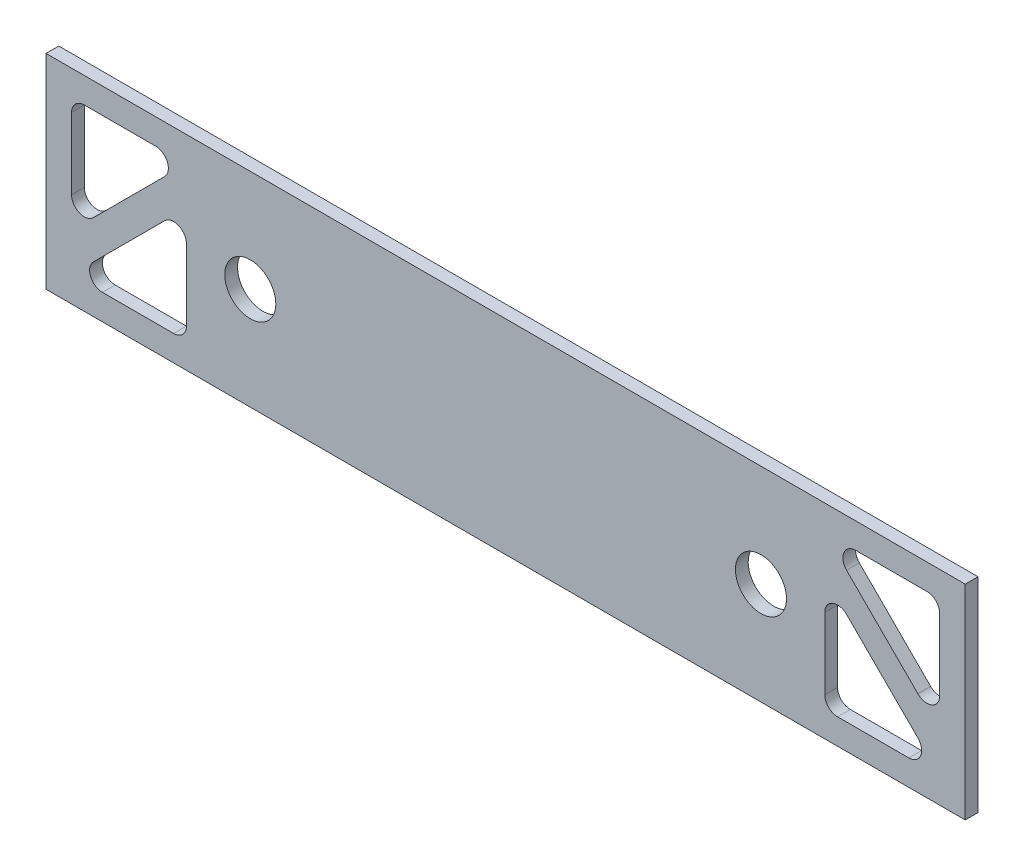
ISO-10303-21;
HEADER;
FILE_DESCRIPTION(('STEP AP214'),'2;1');
FILE_NAME('part.step','',(''),(''),'','','');
FILE_SCHEMA(('AUTOMOTIVE_DESIGN { 1 0 10303 214 1 1 1 1 }'));
ENDSEC;
DATA;
#1=APPLICATION_CONTEXT('core data for automotive mechanical design processes');
#2=APPLICATION_PROTOCOL_DEFINITION('international standard','automotive_design',2000,#1);
#3=PRODUCT_CONTEXT('',#1,'mechanical');
#4=PRODUCT('Part','Part','',(#3));
#5=PRODUCT_RELATED_PRODUCT_CATEGORY('part','',(#4));
#6=PRODUCT_DEFINITION_FORMATION('','',#4);
#7=PRODUCT_DEFINITION_CONTEXT('part definition',#1,'design');
#8=PRODUCT_DEFINITION('design','',#6,#7);
#9=PRODUCT_DEFINITION_SHAPE('','',#8);
#10=(LENGTH_UNIT() NAMED_UNIT(*) SI_UNIT(.MILLI.,.METRE.));
#11=(NAMED_UNIT(*) PLANE_ANGLE_UNIT() SI_UNIT($,.RADIAN.));
#12=(NAMED_UNIT(*) SI_UNIT($,.STERADIAN.) SOLID_ANGLE_UNIT());
#13=UNCERTAINTY_MEASURE_WITH_UNIT(LENGTH_MEASURE(1.E-05),#10,'distance_accuracy_value','');
#14=(GEOMETRIC_REPRESENTATION_CONTEXT(3) GLOBAL_UNCERTAINTY_ASSIGNED_CONTEXT((#13)) GLOBAL_UNIT_ASSIGNED_CONTEXT((#10,
#11,#12)) REPRESENTATION_CONTEXT('',''));
#15=CARTESIAN_POINT('',(0.,0.,0.));
#16=DIRECTION('',(0.,0.,1.));
#17=DIRECTION('',(1.,0.,0.));
#18=AXIS2_PLACEMENT_3D('',#15,#16,#17);
#19=CARTESIAN_POINT('',(457.2,8.61913239514614,-5.08837174822385));
#20=DIRECTION('',(0.,0.,1.));
#21=DIRECTION('',(0.,-1.,0.));
#22=AXIS2_PLACEMENT_3D('',#19,#20,#21);
#23=PLANE('',#22);
#24=DIRECTION('',(0.707106781186548,0.707106781186548,0.));
#25=VECTOR('',#24,1.);
#26=CARTESIAN_POINT('',(59.0098719394653,-33.9709956653885,-5.08837174822385));
#27=LINE('',#26,#25);
#28=CARTESIAN_POINT('',(23.5401280605346,-69.4407395443192,-5.08837174822386));
#29=VERTEX_POINT('',#28);
#30=CARTESIAN_POINT('',(59.0098719394653,-33.9709956653885,-5.08837174822385));
#31=VERTEX_POINT('',#30);
#32=EDGE_CURVE('E249',#29,#31,#27,.T.);
#33=ORIENTED_EDGE('',*,*,#32,.F.);
#34=CARTESIAN_POINT('',(28.0302561210691,-73.9308676048539,-5.08837174822386));
#35=DIRECTION('',(0.,0.,-1.));
#36=DIRECTION('',(0.,-1.,0.));
#37=AXIS2_PLACEMENT_3D('',#34,#35,#36);
#38=CIRCLE('',#37,6.35000000000001);
#39=CARTESIAN_POINT('',(28.0302561210693,-80.2808676048539,-5.08837174822386));
#40=VERTEX_POINT('',#39);
#41=EDGE_CURVE('E46',#40,#29,#38,.T.);
#42=ORIENTED_EDGE('',*,*,#41,.F.);
#43=DIRECTION('',(-1.,0.,0.));
#44=VECTOR('',#43,1.);
#45=CARTESIAN_POINT('',(28.0302561210693,-80.2808676048539,-5.08837174822386));
#46=LINE('',#45,#44);
#47=CARTESIAN_POINT('',(63.4999999999999,-80.2808676048539,-5.08837174822386));
#48=VERTEX_POINT('',#47);
#49=EDGE_CURVE('E235',#48,#40,#46,.T.);
#50=ORIENTED_EDGE('',*,*,#49,.F.);
#51=CARTESIAN_POINT('',(63.4999999999999,-73.9308676048539,-5.08837174822386));
#52=DIRECTION('',(0.,0.,-1.));
#53=DIRECTION('',(0.,-1.,0.));
#54=AXIS2_PLACEMENT_3D('',#51,#52,#53);
#55=CIRCLE('',#54,6.35000000000001);
#56=CARTESIAN_POINT('',(69.85,-73.9308676048538,-5.08837174822386));
#57=VERTEX_POINT('',#56);
#58=EDGE_CURVE('E238',#57,#48,#55,.T.);
#59=ORIENTED_EDGE('',*,*,#58,.F.);
#60=DIRECTION('',(0.,-1.,0.));
#61=VECTOR('',#60,1.);
#62=CARTESIAN_POINT('',(69.85,-73.9308676048538,-5.08837174822386));
#63=LINE('',#62,#61);
#64=CARTESIAN_POINT('',(69.85,-38.4611237259231,-5.08837174822385));
#65=VERTEX_POINT('',#64);
#66=EDGE_CURVE('E254',#65,#57,#63,.T.);
#67=ORIENTED_EDGE('',*,*,#66,.F.);
#68=CARTESIAN_POINT('',(63.4999999999999,-38.461123725923,-5.08837174822385));
#69=DIRECTION('',(0.,0.,-1.));
#70=DIRECTION('',(0.,1.,0.));
#71=AXIS2_PLACEMENT_3D('',#68,#69,#70);
#72=CIRCLE('',#71,6.35000000000001);
#73=EDGE_CURVE('E251',#31,#65,#72,.T.);
#74=ORIENTED_EDGE('',*,*,#73,.F.);
#75=EDGE_LOOP('',(#33,#42,#50,#59,#67,#74));
#76=FACE_BOUND('',#75,.T.);
#77=DIRECTION('',(1.,0.,0.));
#78=VECTOR('',#77,1.);
#79=CARTESIAN_POINT('',(19.05,-4.08086760485386,-5.08837174822385));
#80=LINE('',#79,#78);
#81=CARTESIAN_POINT('',(19.05,-4.08086760485386,-5.08837174822385));
#82=VERTEX_POINT('',#81);
#83=CARTESIAN_POINT('',(54.5197438789307,-4.08086760485386,-5.08837174822385));
#84=VERTEX_POINT('',#83);
#85=EDGE_CURVE('E290',#82,#84,#80,.T.);
#86=ORIENTED_EDGE('',*,*,#85,.F.);
#87=CARTESIAN_POINT('',(19.05,-10.4308676048539,-5.08837174822385));
#88=DIRECTION('',(0.,0.,-1.));
#89=DIRECTION('',(0.,-1.,0.));
#90=AXIS2_PLACEMENT_3D('',#87,#88,#89);
#91=CIRCLE('',#90,6.35000000000001);
#92=CARTESIAN_POINT('',(12.7,-10.4308676048539,-5.08837174822385));
#93=VERTEX_POINT('',#92);
#94=EDGE_CURVE('E261',#93,#82,#91,.T.);
#95=ORIENTED_EDGE('',*,*,#94,.F.);
#96=DIRECTION('',(0.,1.,0.));
#97=VECTOR('',#96,1.);
#98=CARTESIAN_POINT('',(12.7,-10.4308676048539,-5.08837174822385));
#99=LINE('',#98,#97);
#100=CARTESIAN_POINT('',(12.7,-45.9006114837845,-5.08837174822386));
#101=VERTEX_POINT('',#100);
#102=EDGE_CURVE('E273',#101,#93,#99,.T.);
#103=ORIENTED_EDGE('',*,*,#102,.F.);
#104=CARTESIAN_POINT('',(19.05,-45.9006114837847,-5.08837174822386));
#105=DIRECTION('',(0.,0.,-1.));
#106=DIRECTION('',(0.,-1.,0.));
#107=AXIS2_PLACEMENT_3D('',#104,#105,#106);
#108=CIRCLE('',#107,6.35000000000001);
#109=CARTESIAN_POINT('',(23.5401280605347,-50.3907395443192,-5.08837174822386));
#110=VERTEX_POINT('',#109);
#111=EDGE_CURVE('E299',#110,#101,#108,.T.);
#112=ORIENTED_EDGE('',*,*,#111,.F.);
#113=DIRECTION('',(-0.707106781186547,-0.707106781186548,0.));
#114=VECTOR('',#113,1.);
#115=CARTESIAN_POINT('',(23.5401280605347,-50.3907395443192,-5.08837174822386));
#116=LINE('',#115,#114);
#117=CARTESIAN_POINT('',(59.0098719394653,-14.9209956653885,-5.08837174822385));
#118=VERTEX_POINT('',#117);
#119=EDGE_CURVE('E296',#118,#110,#116,.T.);
#120=ORIENTED_EDGE('',*,*,#119,.F.);
#121=CARTESIAN_POINT('',(54.5197438789308,-10.4308676048539,-5.08837174822385));
#122=DIRECTION('',(0.,0.,-1.));
#123=DIRECTION('',(0.,1.,0.));
#124=AXIS2_PLACEMENT_3D('',#121,#122,#123);
#125=CIRCLE('',#124,6.34999999999999);
#126=EDGE_CURVE('E293',#84,#118,#125,.T.);
#127=ORIENTED_EDGE('',*,*,#126,.F.);
#128=EDGE_LOOP('',(#86,#95,#103,#112,#120,#127));
#129=FACE_BOUND('',#128,.T.);
#130=DIRECTION('',(-0.707106781186547,0.707106781186548,0.));
#131=VECTOR('',#130,1.);
#132=CARTESIAN_POINT('',(433.659871939465,-50.3907395443192,-5.08837174822386));
#133=LINE('',#132,#131);
#134=CARTESIAN_POINT('',(433.659871939465,-50.3907395443191,-5.08837174822386));
#135=VERTEX_POINT('',#134);
#136=CARTESIAN_POINT('',(398.190128060535,-14.9209956653885,-5.08837174822385));
#137=VERTEX_POINT('',#136);
#138=EDGE_CURVE('E338',#135,#137,#133,.T.);
#139=ORIENTED_EDGE('',*,*,#138,.F.);
#140=CARTESIAN_POINT('',(438.15,-45.9006114837847,-5.08837174822386));
#141=DIRECTION('',(0.,0.,-1.));
#142=DIRECTION('',(0.,1.,0.));
#143=AXIS2_PLACEMENT_3D('',#140,#141,#142);
#144=CIRCLE('',#143,6.35000000000001);
#145=CARTESIAN_POINT('',(444.5,-45.9006114837845,-5.08837174822386));
#146=VERTEX_POINT('',#145);
#147=EDGE_CURVE('E306',#146,#135,#144,.T.);
#148=ORIENTED_EDGE('',*,*,#147,.F.);
#149=DIRECTION('',(0.,-1.,0.));
#150=VECTOR('',#149,1.);
#151=CARTESIAN_POINT('',(444.5,-10.4308676048539,-5.08837174822385));
#152=LINE('',#151,#150);
#153=CARTESIAN_POINT('',(444.5,-10.4308676048539,-5.08837174822385));
#154=VERTEX_POINT('',#153);
#155=EDGE_CURVE('E321',#154,#146,#152,.T.);
#156=ORIENTED_EDGE('',*,*,#155,.F.);
#157=CARTESIAN_POINT('',(438.15,-10.4308676048539,-5.08837174822385));
#158=DIRECTION('',(0.,0.,-1.));
#159=DIRECTION('',(0.,1.,0.));
#160=AXIS2_PLACEMENT_3D('',#157,#158,#159);
#161=CIRCLE('',#160,6.35000000000001);
#162=CARTESIAN_POINT('',(438.15,-4.08086760485385,-5.08837174822385));
#163=VERTEX_POINT('',#162);
#164=EDGE_CURVE('E347',#163,#154,#161,.T.);
#165=ORIENTED_EDGE('',*,*,#164,.F.);
#166=DIRECTION('',(1.,0.,0.));
#167=VECTOR('',#166,1.);
#168=CARTESIAN_POINT('',(438.15,-4.08086760485386,-5.08837174822385));
#169=LINE('',#168,#167);
#170=CARTESIAN_POINT('',(402.680256121069,-4.08086760485386,-5.08837174822385));
#171=VERTEX_POINT('',#170);
#172=EDGE_CURVE('E344',#171,#163,#169,.T.);
#173=ORIENTED_EDGE('',*,*,#172,.F.);
#174=CARTESIAN_POINT('',(402.680256121069,-10.4308676048539,-5.08837174822385));
#175=DIRECTION('',(0.,0.,-1.));
#176=DIRECTION('',(0.,-1.,0.));
#177=AXIS2_PLACEMENT_3D('',#174,#175,#176);
#178=CIRCLE('',#177,6.34999999999999);
#179=EDGE_CURVE('E341',#137,#171,#178,.T.);
#180=ORIENTED_EDGE('',*,*,#179,.F.);
#181=EDGE_LOOP('',(#139,#148,#156,#165,#173,#180));
#182=FACE_BOUND('',#181,.T.);
#183=DIRECTION('',(0.707106781186548,-0.707106781186548,0.));
#184=VECTOR('',#183,1.);
#185=CARTESIAN_POINT('',(398.190128060535,-33.9709956653885,-5.08837174822385));
#186=LINE('',#185,#184);
#187=CARTESIAN_POINT('',(398.190128060535,-33.9709956653885,-5.08837174822385));
#188=VERTEX_POINT('',#187);
#189=CARTESIAN_POINT('',(433.659871939465,-69.4407395443192,-5.08837174822386));
#190=VERTEX_POINT('',#189);
#191=EDGE_CURVE('E386',#188,#190,#186,.T.);
#192=ORIENTED_EDGE('',*,*,#191,.F.);
#193=CARTESIAN_POINT('',(393.7,-38.461123725923,-5.08837174822385));
#194=DIRECTION('',(0.,0.,-1.));
#195=DIRECTION('',(0.,-1.,0.));
#196=AXIS2_PLACEMENT_3D('',#193,#194,#195);
#197=CIRCLE('',#196,6.35000000000001);
#198=CARTESIAN_POINT('',(387.35,-38.4611237259231,-5.08837174822385));
#199=VERTEX_POINT('',#198);
#200=EDGE_CURVE('E354',#199,#188,#197,.T.);
#201=ORIENTED_EDGE('',*,*,#200,.F.);
#202=DIRECTION('',(0.,1.,0.));
#203=VECTOR('',#202,1.);
#204=CARTESIAN_POINT('',(387.35,-73.9308676048538,-5.08837174822386));
#205=LINE('',#204,#203);
#206=CARTESIAN_POINT('',(387.35,-73.9308676048538,-5.08837174822386));
#207=VERTEX_POINT('',#206);
#208=EDGE_CURVE('E369',#207,#199,#205,.T.);
#209=ORIENTED_EDGE('',*,*,#208,.F.);
#210=CARTESIAN_POINT('',(393.7,-73.9308676048539,-5.08837174822386));
#211=DIRECTION('',(0.,0.,-1.));
#212=DIRECTION('',(0.,1.,0.));
#213=AXIS2_PLACEMENT_3D('',#210,#211,#212);
#214=CIRCLE('',#213,6.35000000000001);
#215=CARTESIAN_POINT('',(393.7,-80.2808676048539,-5.08837174822386));
#216=VERTEX_POINT('',#215);
#217=EDGE_CURVE('E395',#216,#207,#214,.T.);
#218=ORIENTED_EDGE('',*,*,#217,.F.);
#219=DIRECTION('',(-1.,0.,0.));
#220=VECTOR('',#219,1.);
#221=CARTESIAN_POINT('',(429.169743878931,-80.2808676048539,-5.08837174822386));
#222=LINE('',#221,#220);
#223=CARTESIAN_POINT('',(429.169743878931,-80.2808676048539,-5.08837174822386));
#224=VERTEX_POINT('',#223);
#225=EDGE_CURVE('E392',#224,#216,#222,.T.);
#226=ORIENTED_EDGE('',*,*,#225,.F.);
#227=CARTESIAN_POINT('',(429.169743878931,-73.9308676048539,-5.08837174822386));
#228=DIRECTION('',(0.,0.,-1.));
#229=DIRECTION('',(0.,1.,0.));
#230=AXIS2_PLACEMENT_3D('',#227,#228,#229);
#231=CIRCLE('',#230,6.35000000000001);
#232=EDGE_CURVE('E389',#190,#224,#231,.T.);
#233=ORIENTED_EDGE('',*,*,#232,.F.);
#234=EDGE_LOOP('',(#192,#201,#209,#218,#226,#233));
#235=FACE_BOUND('',#234,.T.);
#236=CARTESIAN_POINT('',(101.6,-42.1808676048539,-5.08837174822385));
#237=DIRECTION('',(0.,0.,-1.));
#238=DIRECTION('',(0.,1.,0.));
#239=AXIS2_PLACEMENT_3D('',#236,#237,#238);
#240=CIRCLE('',#239,12.7);
#241=CARTESIAN_POINT('',(101.6,-29.4808676048539,-5.08837174822385));
#242=VERTEX_POINT('',#241);
#243=EDGE_CURVE('E402',#242,#242,#240,.T.);
#244=ORIENTED_EDGE('',*,*,#243,.F.);
#245=EDGE_LOOP('',(#244));
#246=FACE_BOUND('',#245,.T.);
#247=CARTESIAN_POINT('',(355.6,-42.1808676048539,-5.08837174822385));
#248=DIRECTION('',(0.,0.,-1.));
#249=DIRECTION('',(0.,1.,0.));
#250=AXIS2_PLACEMENT_3D('',#247,#248,#249);
#251=CIRCLE('',#250,12.7);
#252=CARTESIAN_POINT('',(355.6,-29.4808676048539,-5.08837174822385));
#253=VERTEX_POINT('',#252);
#254=EDGE_CURVE('E416',#253,#253,#251,.T.);
#255=ORIENTED_EDGE('',*,*,#254,.F.);
#256=EDGE_LOOP('',(#255));
#257=FACE_BOUND('',#256,.T.);
#258=DIRECTION('',(0.,1.,0.));
#259=VECTOR('',#258,1.);
#260=CARTESIAN_POINT('',(0.,8.61913239514614,-5.08837174822385));
#261=LINE('',#260,#259);
#262=CARTESIAN_POINT('',(0.,-92.9808676048539,-5.08837174822386));
#263=VERTEX_POINT('',#262);
#264=CARTESIAN_POINT('',(0.,8.61913239514614,-5.08837174822385));
#265=VERTEX_POINT('',#264);
#266=EDGE_CURVE('E422',#263,#265,#261,.T.);
#267=ORIENTED_EDGE('',*,*,#266,.T.);
#268=DIRECTION('',(-1.,0.,0.));
#269=VECTOR('',#268,1.);
#270=CARTESIAN_POINT('',(457.2,8.61913239514614,-5.08837174822385));
#271=LINE('',#270,#269);
#272=CARTESIAN_POINT('',(457.2,8.61913239514614,-5.08837174822385));
#273=VERTEX_POINT('',#272);
#274=EDGE_CURVE('E11',#273,#265,#271,.T.);
#275=ORIENTED_EDGE('',*,*,#274,.F.);
#276=DIRECTION('',(0.,1.,0.));
#277=VECTOR('',#276,1.);
#278=CARTESIAN_POINT('',(457.2,8.61913239514614,-5.08837174822385));
#279=LINE('',#278,#277);
#280=CARTESIAN_POINT('',(457.2,-92.9808676048539,-5.08837174822386));
#281=VERTEX_POINT('',#280);
#282=EDGE_CURVE('E425',#281,#273,#279,.T.);
#283=ORIENTED_EDGE('',*,*,#282,.F.);
#284=DIRECTION('',(-1.,0.,0.));
#285=VECTOR('',#284,1.);
#286=CARTESIAN_POINT('',(457.2,-92.9808676048539,-5.08837174822386));
#287=LINE('',#286,#285);
#288=EDGE_CURVE('E435',#281,#263,#287,.T.);
#289=ORIENTED_EDGE('',*,*,#288,.T.);
#290=EDGE_LOOP('',(#267,#275,#283,#289));
#291=FACE_BOUND('',#290,.T.);
#292=ADVANCED_FACE('F32',(#76,#129,#182,#235,#246,#257,#291),#23,.F.);
#293=CARTESIAN_POINT('',(457.2,8.61913239514614,-5.08837174822385));
#294=DIRECTION('',(0.,-1.,0.));
#295=DIRECTION('',(0.,0.,-1.));
#296=AXIS2_PLACEMENT_3D('',#293,#294,#295);
#297=PLANE('',#296);
#298=DIRECTION('',(0.,0.,1.));
#299=VECTOR('',#298,1.);
#300=CARTESIAN_POINT('',(0.,8.61913239514614,-5.08837174822385));
#301=LINE('',#300,#299);
#302=CARTESIAN_POINT('',(0.,8.61913239514614,1.26162825177615));
#303=VERTEX_POINT('',#302);
#304=EDGE_CURVE('E438',#265,#303,#301,.T.);
#305=ORIENTED_EDGE('',*,*,#304,.T.);
#306=DIRECTION('',(-1.,0.,0.));
#307=VECTOR('',#306,1.);
#308=CARTESIAN_POINT('',(457.2,8.61913239514614,1.26162825177615));
#309=LINE('',#308,#307);
#310=CARTESIAN_POINT('',(457.2,8.61913239514614,1.26162825177615));
#311=VERTEX_POINT('',#310);
#312=EDGE_CURVE('E39',#311,#303,#309,.T.);
#313=ORIENTED_EDGE('',*,*,#312,.F.);
#314=DIRECTION('',(0.,0.,1.));
#315=VECTOR('',#314,1.);
#316=CARTESIAN_POINT('',(457.2,8.61913239514614,-5.08837174822385));
#317=LINE('',#316,#315);
#318=EDGE_CURVE('E428',#273,#311,#317,.T.);
#319=ORIENTED_EDGE('',*,*,#318,.F.);
#320=ORIENTED_EDGE('',*,*,#274,.T.);
#321=EDGE_LOOP('',(#305,#313,#319,#320));
#322=FACE_BOUND('',#321,.T.);
#323=ADVANCED_FACE('F467',(#322),#297,.F.);
#324=CARTESIAN_POINT('',(457.2,8.61913239514614,1.26162825177615));
#325=DIRECTION('',(0.,0.,-1.));
#326=DIRECTION('',(0.,1.,0.));
#327=AXIS2_PLACEMENT_3D('',#324,#325,#326);
#328=PLANE('',#327);
#329=DIRECTION('',(-1.,0.,0.));
#330=VECTOR('',#329,1.);
#331=CARTESIAN_POINT('',(28.0302561210693,-80.2808676048539,1.26162825177616));
#332=LINE('',#331,#330);
#333=CARTESIAN_POINT('',(63.4999999999999,-80.2808676048539,1.26162825177616));
#334=VERTEX_POINT('',#333);
#335=CARTESIAN_POINT('',(28.0302561210693,-80.2808676048539,1.26162825177616));
#336=VERTEX_POINT('',#335);
#337=EDGE_CURVE('E224',#334,#336,#332,.T.);
#338=ORIENTED_EDGE('',*,*,#337,.T.);
#339=CARTESIAN_POINT('',(28.0302561210691,-73.9308676048539,1.26162825177616));
#340=DIRECTION('',(0.,0.,-1.));
#341=DIRECTION('',(0.,-1.,0.));
#342=AXIS2_PLACEMENT_3D('',#339,#340,#341);
#343=CIRCLE('',#342,6.35000000000001);
#344=CARTESIAN_POINT('',(23.5401280605346,-69.4407395443192,1.26162825177616));
#345=VERTEX_POINT('',#344);
#346=EDGE_CURVE('E218',#336,#345,#343,.T.);
#347=ORIENTED_EDGE('',*,*,#346,.T.);
#348=DIRECTION('',(0.707106781186548,0.707106781186548,0.));
#349=VECTOR('',#348,1.);
#350=CARTESIAN_POINT('',(59.0098719394653,-33.9709956653885,1.26162825177616));
#351=LINE('',#350,#349);
#352=CARTESIAN_POINT('',(59.0098719394653,-33.9709956653885,1.26162825177615));
#353=VERTEX_POINT('',#352);
#354=EDGE_CURVE('E227',#345,#353,#351,.T.);
#355=ORIENTED_EDGE('',*,*,#354,.T.);
#356=CARTESIAN_POINT('',(63.4999999999999,-38.461123725923,1.26162825177616));
#357=DIRECTION('',(0.,0.,-1.));
#358=DIRECTION('',(0.,1.,0.));
#359=AXIS2_PLACEMENT_3D('',#356,#357,#358);
#360=CIRCLE('',#359,6.35000000000001);
#361=CARTESIAN_POINT('',(69.85,-38.4611237259231,1.26162825177616));
#362=VERTEX_POINT('',#361);
#363=EDGE_CURVE('E54',#353,#362,#360,.T.);
#364=ORIENTED_EDGE('',*,*,#363,.T.);
#365=DIRECTION('',(0.,-1.,0.));
#366=VECTOR('',#365,1.);
#367=CARTESIAN_POINT('',(69.85,-73.9308676048538,1.26162825177616));
#368=LINE('',#367,#366);
#369=CARTESIAN_POINT('',(69.85,-73.9308676048538,1.26162825177616));
#370=VERTEX_POINT('',#369);
#371=EDGE_CURVE('E242',#362,#370,#368,.T.);
#372=ORIENTED_EDGE('',*,*,#371,.T.);
#373=CARTESIAN_POINT('',(63.4999999999999,-73.9308676048539,1.26162825177616));
#374=DIRECTION('',(0.,0.,-1.));
#375=DIRECTION('',(0.,-1.,0.));
#376=AXIS2_PLACEMENT_3D('',#373,#374,#375);
#377=CIRCLE('',#376,6.35000000000001);
#378=EDGE_CURVE('E245',#370,#334,#377,.T.);
#379=ORIENTED_EDGE('',*,*,#378,.T.);
#380=EDGE_LOOP('',(#338,#347,#355,#364,#372,#379));
#381=FACE_BOUND('',#380,.T.);
#382=DIRECTION('',(0.,1.,0.));
#383=VECTOR('',#382,1.);
#384=CARTESIAN_POINT('',(12.7,-10.4308676048539,1.26162825177617));
#385=LINE('',#384,#383);
#386=CARTESIAN_POINT('',(12.7,-45.9006114837845,1.26162825177616));
#387=VERTEX_POINT('',#386);
#388=CARTESIAN_POINT('',(12.7,-10.4308676048539,1.26162825177617));
#389=VERTEX_POINT('',#388);
#390=EDGE_CURVE('E285',#387,#389,#385,.T.);
#391=ORIENTED_EDGE('',*,*,#390,.T.);
#392=CARTESIAN_POINT('',(19.05,-10.4308676048539,1.26162825177617));
#393=DIRECTION('',(0.,0.,-1.));
#394=DIRECTION('',(0.,-1.,0.));
#395=AXIS2_PLACEMENT_3D('',#392,#393,#394);
#396=CIRCLE('',#395,6.35000000000001);
#397=CARTESIAN_POINT('',(19.05,-4.08086760485386,1.26162825177617));
#398=VERTEX_POINT('',#397);
#399=EDGE_CURVE('E269',#389,#398,#396,.T.);
#400=ORIENTED_EDGE('',*,*,#399,.T.);
#401=DIRECTION('',(1.,0.,0.));
#402=VECTOR('',#401,1.);
#403=CARTESIAN_POINT('',(19.05,-4.08086760485386,1.26162825177617));
#404=LINE('',#403,#402);
#405=CARTESIAN_POINT('',(54.5197438789307,-4.08086760485386,1.26162825177615));
#406=VERTEX_POINT('',#405);
#407=EDGE_CURVE('E272',#398,#406,#404,.T.);
#408=ORIENTED_EDGE('',*,*,#407,.T.);
#409=CARTESIAN_POINT('',(54.5197438789308,-10.4308676048539,1.26162825177617));
#410=DIRECTION('',(0.,0.,-1.));
#411=DIRECTION('',(0.,1.,0.));
#412=AXIS2_PLACEMENT_3D('',#409,#410,#411);
#413=CIRCLE('',#412,6.34999999999999);
#414=CARTESIAN_POINT('',(59.0098719394653,-14.9209956653885,1.26162825177617));
#415=VERTEX_POINT('',#414);
#416=EDGE_CURVE('E276',#406,#415,#413,.T.);
#417=ORIENTED_EDGE('',*,*,#416,.T.);
#418=DIRECTION('',(-0.707106781186547,-0.707106781186548,0.));
#419=VECTOR('',#418,1.);
#420=CARTESIAN_POINT('',(23.5401280605347,-50.3907395443192,1.26162825177616));
#421=LINE('',#420,#419);
#422=CARTESIAN_POINT('',(23.5401280605347,-50.3907395443192,1.26162825177616));
#423=VERTEX_POINT('',#422);
#424=EDGE_CURVE('E279',#415,#423,#421,.T.);
#425=ORIENTED_EDGE('',*,*,#424,.T.);
#426=CARTESIAN_POINT('',(19.05,-45.9006114837847,1.26162825177616));
#427=DIRECTION('',(0.,0.,-1.));
#428=DIRECTION('',(0.,-1.,0.));
#429=AXIS2_PLACEMENT_3D('',#426,#427,#428);
#430=CIRCLE('',#429,6.35000000000001);
#431=EDGE_CURVE('E282',#423,#387,#430,.T.);
#432=ORIENTED_EDGE('',*,*,#431,.T.);
#433=EDGE_LOOP('',(#391,#400,#408,#417,#425,#432));
#434=FACE_BOUND('',#433,.T.);
#435=DIRECTION('',(0.,-1.,0.));
#436=VECTOR('',#435,1.);
#437=CARTESIAN_POINT('',(444.5,-10.4308676048539,1.26162825177617));
#438=LINE('',#437,#436);
#439=CARTESIAN_POINT('',(444.5,-10.4308676048539,1.26162825177617));
#440=VERTEX_POINT('',#439);
#441=CARTESIAN_POINT('',(444.5,-45.9006114837845,1.26162825177616));
#442=VERTEX_POINT('',#441);
#443=EDGE_CURVE('E333',#440,#442,#438,.T.);
#444=ORIENTED_EDGE('',*,*,#443,.T.);
#445=CARTESIAN_POINT('',(438.15,-45.9006114837847,1.26162825177616));
#446=DIRECTION('',(0.,0.,-1.));
#447=DIRECTION('',(0.,1.,0.));
#448=AXIS2_PLACEMENT_3D('',#445,#446,#447);
#449=CIRCLE('',#448,6.35000000000001);
#450=CARTESIAN_POINT('',(433.659871939465,-50.3907395443192,1.26162825177616));
#451=VERTEX_POINT('',#450);
#452=EDGE_CURVE('E317',#442,#451,#449,.T.);
#453=ORIENTED_EDGE('',*,*,#452,.T.);
#454=DIRECTION('',(-0.707106781186547,0.707106781186548,0.));
#455=VECTOR('',#454,1.);
#456=CARTESIAN_POINT('',(433.659871939465,-50.3907395443192,1.26162825177616));
#457=LINE('',#456,#455);
#458=CARTESIAN_POINT('',(398.190128060535,-14.9209956653886,1.26162825177615));
#459=VERTEX_POINT('',#458);
#460=EDGE_CURVE('E320',#451,#459,#457,.T.);
#461=ORIENTED_EDGE('',*,*,#460,.T.);
#462=CARTESIAN_POINT('',(402.680256121069,-10.4308676048539,1.26162825177617));
#463=DIRECTION('',(0.,0.,-1.));
#464=DIRECTION('',(0.,-1.,0.));
#465=AXIS2_PLACEMENT_3D('',#462,#463,#464);
#466=CIRCLE('',#465,6.34999999999999);
#467=CARTESIAN_POINT('',(402.680256121069,-4.08086760485386,1.26162825177617));
#468=VERTEX_POINT('',#467);
#469=EDGE_CURVE('E324',#459,#468,#466,.T.);
#470=ORIENTED_EDGE('',*,*,#469,.T.);
#471=DIRECTION('',(1.,0.,0.));
#472=VECTOR('',#471,1.);
#473=CARTESIAN_POINT('',(438.15,-4.08086760485386,1.26162825177617));
#474=LINE('',#473,#472);
#475=CARTESIAN_POINT('',(438.15,-4.08086760485385,1.26162825177617));
#476=VERTEX_POINT('',#475);
#477=EDGE_CURVE('E327',#468,#476,#474,.T.);
#478=ORIENTED_EDGE('',*,*,#477,.T.);
#479=CARTESIAN_POINT('',(438.15,-10.4308676048539,1.26162825177617));
#480=DIRECTION('',(0.,0.,-1.));
#481=DIRECTION('',(0.,1.,0.));
#482=AXIS2_PLACEMENT_3D('',#479,#480,#481);
#483=CIRCLE('',#482,6.35000000000001);
#484=EDGE_CURVE('E330',#476,#440,#483,.T.);
#485=ORIENTED_EDGE('',*,*,#484,.T.);
#486=EDGE_LOOP('',(#444,#453,#461,#470,#478,#485));
#487=FACE_BOUND('',#486,.T.);
#488=DIRECTION('',(0.,1.,0.));
#489=VECTOR('',#488,1.);
#490=CARTESIAN_POINT('',(387.35,-73.9308676048538,1.26162825177616));
#491=LINE('',#490,#489);
#492=CARTESIAN_POINT('',(387.35,-73.9308676048538,1.26162825177616));
#493=VERTEX_POINT('',#492);
#494=CARTESIAN_POINT('',(387.35,-38.4611237259231,1.26162825177616));
#495=VERTEX_POINT('',#494);
#496=EDGE_CURVE('E381',#493,#495,#491,.T.);
#497=ORIENTED_EDGE('',*,*,#496,.T.);
#498=CARTESIAN_POINT('',(393.7,-38.461123725923,1.26162825177616));
#499=DIRECTION('',(0.,0.,-1.));
#500=DIRECTION('',(0.,-1.,0.));
#501=AXIS2_PLACEMENT_3D('',#498,#499,#500);
#502=CIRCLE('',#501,6.35000000000001);
#503=CARTESIAN_POINT('',(398.190128060535,-33.9709956653885,1.26162825177616));
#504=VERTEX_POINT('',#503);
#505=EDGE_CURVE('E365',#495,#504,#502,.T.);
#506=ORIENTED_EDGE('',*,*,#505,.T.);
#507=DIRECTION('',(0.707106781186548,-0.707106781186548,0.));
#508=VECTOR('',#507,1.);
#509=CARTESIAN_POINT('',(398.190128060535,-33.9709956653885,1.26162825177616));
#510=LINE('',#509,#508);
#511=CARTESIAN_POINT('',(433.659871939465,-69.4407395443191,1.26162825177614));
#512=VERTEX_POINT('',#511);
#513=EDGE_CURVE('E368',#504,#512,#510,.T.);
#514=ORIENTED_EDGE('',*,*,#513,.T.);
#515=CARTESIAN_POINT('',(429.169743878931,-73.9308676048539,1.26162825177616));
#516=DIRECTION('',(0.,0.,-1.));
#517=DIRECTION('',(0.,1.,0.));
#518=AXIS2_PLACEMENT_3D('',#515,#516,#517);
#519=CIRCLE('',#518,6.35000000000001);
#520=CARTESIAN_POINT('',(429.169743878931,-80.2808676048539,1.26162825177616));
#521=VERTEX_POINT('',#520);
#522=EDGE_CURVE('E372',#512,#521,#519,.T.);
#523=ORIENTED_EDGE('',*,*,#522,.T.);
#524=DIRECTION('',(-1.,0.,0.));
#525=VECTOR('',#524,1.);
#526=CARTESIAN_POINT('',(429.169743878931,-80.2808676048539,1.26162825177616));
#527=LINE('',#526,#525);
#528=CARTESIAN_POINT('',(393.7,-80.2808676048539,1.26162825177616));
#529=VERTEX_POINT('',#528);
#530=EDGE_CURVE('E375',#521,#529,#527,.T.);
#531=ORIENTED_EDGE('',*,*,#530,.T.);
#532=CARTESIAN_POINT('',(393.7,-73.9308676048539,1.26162825177616));
#533=DIRECTION('',(0.,0.,-1.));
#534=DIRECTION('',(0.,1.,0.));
#535=AXIS2_PLACEMENT_3D('',#532,#533,#534);
#536=CIRCLE('',#535,6.35000000000001);
#537=EDGE_CURVE('E378',#529,#493,#536,.T.);
#538=ORIENTED_EDGE('',*,*,#537,.T.);
#539=EDGE_LOOP('',(#497,#506,#514,#523,#531,#538));
#540=FACE_BOUND('',#539,.T.);
#541=CARTESIAN_POINT('',(101.6,-42.1808676048539,1.26162825177616));
#542=DIRECTION('',(0.,0.,-1.));
#543=DIRECTION('',(0.,1.,0.));
#544=AXIS2_PLACEMENT_3D('',#541,#542,#543);
#545=CIRCLE('',#544,12.7);
#546=CARTESIAN_POINT('',(101.6,-29.4808676048539,1.26162825177616));
#547=VERTEX_POINT('',#546);
#548=EDGE_CURVE('E413',#547,#547,#545,.T.);
#549=ORIENTED_EDGE('',*,*,#548,.T.);
#550=EDGE_LOOP('',(#549));
#551=FACE_BOUND('',#550,.T.);
#552=CARTESIAN_POINT('',(355.6,-42.1808676048539,1.26162825177616));
#553=DIRECTION('',(0.,0.,-1.));
#554=DIRECTION('',(0.,1.,0.));
#555=AXIS2_PLACEMENT_3D('',#552,#553,#554);
#556=CIRCLE('',#555,12.7);
#557=CARTESIAN_POINT('',(355.6,-29.4808676048539,1.26162825177616));
#558=VERTEX_POINT('',#557);
#559=EDGE_CURVE('E419',#558,#558,#556,.T.);
#560=ORIENTED_EDGE('',*,*,#559,.T.);
#561=EDGE_LOOP('',(#560));
#562=FACE_BOUND('',#561,.T.);
#563=DIRECTION('',(0.,-1.,0.));
#564=VECTOR('',#563,1.);
#565=CARTESIAN_POINT('',(0.,8.61913239514614,1.26162825177615));
#566=LINE('',#565,#564);
#567=CARTESIAN_POINT('',(0.,-92.9808676048539,1.26162825177614));
#568=VERTEX_POINT('',#567);
#569=EDGE_CURVE('E440',#303,#568,#566,.T.);
#570=ORIENTED_EDGE('',*,*,#569,.T.);
#571=DIRECTION('',(-1.,0.,0.));
#572=VECTOR('',#571,1.);
#573=CARTESIAN_POINT('',(457.2,-92.9808676048539,1.26162825177614));
#574=LINE('',#573,#572);
#575=CARTESIAN_POINT('',(457.2,-92.9808676048539,1.26162825177614));
#576=VERTEX_POINT('',#575);
#577=EDGE_CURVE('E445',#576,#568,#574,.T.);
#578=ORIENTED_EDGE('',*,*,#577,.F.);
#579=DIRECTION('',(0.,-1.,0.));
#580=VECTOR('',#579,1.);
#581=CARTESIAN_POINT('',(457.2,8.61913239514614,1.26162825177615));
#582=LINE('',#581,#580);
#583=EDGE_CURVE('E431',#311,#576,#582,.T.);
#584=ORIENTED_EDGE('',*,*,#583,.F.);
#585=ORIENTED_EDGE('',*,*,#312,.T.);
#586=EDGE_LOOP('',(#570,#578,#584,#585));
#587=FACE_BOUND('',#586,.T.);
#588=ADVANCED_FACE('F231',(#381,#434,#487,#540,#551,#562,#587),#328,.F.);
#589=CARTESIAN_POINT('',(457.2,-92.9808676048539,-5.08837174822386));
#590=DIRECTION('',(0.,1.,0.));
#591=DIRECTION('',(0.,0.,1.));
#592=AXIS2_PLACEMENT_3D('',#589,#590,#591);
#593=PLANE('',#592);
#594=DIRECTION('',(0.,0.,-1.));
#595=VECTOR('',#594,1.);
#596=CARTESIAN_POINT('',(0.,-92.9808676048539,-5.08837174822386));
#597=LINE('',#596,#595);
#598=EDGE_CURVE('E429',#568,#263,#597,.T.);
#599=ORIENTED_EDGE('',*,*,#598,.T.);
#600=ORIENTED_EDGE('',*,*,#288,.F.);
#601=DIRECTION('',(0.,0.,-1.));
#602=VECTOR('',#601,1.);
#603=CARTESIAN_POINT('',(457.2,-92.9808676048539,-5.08837174822386));
#604=LINE('',#603,#602);
#605=EDGE_CURVE('E433',#576,#281,#604,.T.);
#606=ORIENTED_EDGE('',*,*,#605,.F.);
#607=ORIENTED_EDGE('',*,*,#577,.T.);
#608=EDGE_LOOP('',(#599,#600,#606,#607));
#609=FACE_BOUND('',#608,.T.);
#610=ADVANCED_FACE('F460',(#609),#593,.F.);
#611=CARTESIAN_POINT('',(457.2,0.,0.));
#612=DIRECTION('',(-1.,0.,0.));
#613=DIRECTION('',(0.,0.,1.));
#614=AXIS2_PLACEMENT_3D('',#611,#612,#613);
#615=PLANE('',#614);
#616=ORIENTED_EDGE('',*,*,#282,.T.);
#617=ORIENTED_EDGE('',*,*,#318,.T.);
#618=ORIENTED_EDGE('',*,*,#583,.T.);
#619=ORIENTED_EDGE('',*,*,#605,.T.);
#620=EDGE_LOOP('',(#616,#617,#618,#619));
#621=FACE_BOUND('',#620,.T.);
#622=ADVANCED_FACE('F466',(#621),#615,.F.);
#623=CARTESIAN_POINT('',(0.,0.,0.));
#624=DIRECTION('',(-1.,0.,0.));
#625=DIRECTION('',(0.,0.,1.));
#626=AXIS2_PLACEMENT_3D('',#623,#624,#625);
#627=PLANE('',#626);
#628=ORIENTED_EDGE('',*,*,#266,.F.);
#629=ORIENTED_EDGE('',*,*,#598,.F.);
#630=ORIENTED_EDGE('',*,*,#569,.F.);
#631=ORIENTED_EDGE('',*,*,#304,.F.);
#632=EDGE_LOOP('',(#628,#629,#630,#631));
#633=FACE_BOUND('',#632,.T.);
#634=ADVANCED_FACE('F457',(#633),#627,.T.);
#635=CARTESIAN_POINT('',(355.6,-42.1808676048539,1.26162825177616));
#636=DIRECTION('',(0.,0.,-1.));
#637=DIRECTION('',(0.,1.,0.));
#638=AXIS2_PLACEMENT_3D('',#635,#636,#637);
#639=CYLINDRICAL_SURFACE('',#638,12.7);
#640=ORIENTED_EDGE('',*,*,#559,.F.);
#641=EDGE_LOOP('',(#640));
#642=FACE_BOUND('',#641,.T.);
#643=ORIENTED_EDGE('',*,*,#254,.T.);
#644=EDGE_LOOP('',(#643));
#645=FACE_BOUND('',#644,.T.);
#646=ADVANCED_FACE('F482',(#642,#645),#639,.F.);
#647=CARTESIAN_POINT('',(101.6,-42.1808676048539,1.26162825177616));
#648=DIRECTION('',(0.,0.,-1.));
#649=DIRECTION('',(0.,1.,0.));
#650=AXIS2_PLACEMENT_3D('',#647,#648,#649);
#651=CYLINDRICAL_SURFACE('',#650,12.7);
#652=ORIENTED_EDGE('',*,*,#548,.F.);
#653=EDGE_LOOP('',(#652));
#654=FACE_BOUND('',#653,.T.);
#655=ORIENTED_EDGE('',*,*,#243,.T.);
#656=EDGE_LOOP('',(#655));
#657=FACE_BOUND('',#656,.T.);
#658=ADVANCED_FACE('F487',(#654,#657),#651,.F.);
#659=CARTESIAN_POINT('',(393.7,-38.461123725923,1.26162825177616));
#660=DIRECTION('',(0.,0.,-1.));
#661=DIRECTION('',(0.,1.,0.));
#662=AXIS2_PLACEMENT_3D('',#659,#660,#661);
#663=CYLINDRICAL_SURFACE('',#662,6.35000000000001);
#664=ORIENTED_EDGE('',*,*,#200,.T.);
#665=DIRECTION('',(0.,0.,-1.));
#666=VECTOR('',#665,1.);
#667=CARTESIAN_POINT('',(398.190128060535,-33.9709956653885,1.26162825177616));
#668=LINE('',#667,#666);
#669=EDGE_CURVE('E384',#504,#188,#668,.T.);
#670=ORIENTED_EDGE('',*,*,#669,.F.);
#671=ORIENTED_EDGE('',*,*,#505,.F.);
#672=DIRECTION('',(0.,0.,-1.));
#673=VECTOR('',#672,1.);
#674=CARTESIAN_POINT('',(387.35,-38.4611237259231,1.26162825177616));
#675=LINE('',#674,#673);
#676=EDGE_CURVE('E400',#495,#199,#675,.T.);
#677=ORIENTED_EDGE('',*,*,#676,.T.);
#678=EDGE_LOOP('',(#664,#670,#671,#677));
#679=FACE_BOUND('',#678,.T.);
#680=ADVANCED_FACE('F491',(#679),#663,.F.);
#681=CARTESIAN_POINT('',(387.35,-73.9308676048538,1.26162825177616));
#682=DIRECTION('',(-1.,0.,0.));
#683=DIRECTION('',(0.,0.,1.));
#684=AXIS2_PLACEMENT_3D('',#681,#682,#683);
#685=PLANE('',#684);
#686=ORIENTED_EDGE('',*,*,#208,.T.);
#687=ORIENTED_EDGE('',*,*,#676,.F.);
#688=ORIENTED_EDGE('',*,*,#496,.F.);
#689=DIRECTION('',(0.,0.,-1.));
#690=VECTOR('',#689,1.);
#691=CARTESIAN_POINT('',(387.35,-73.9308676048538,1.26162825177616));
#692=LINE('',#691,#690);
#693=EDGE_CURVE('E403',#493,#207,#692,.T.);
#694=ORIENTED_EDGE('',*,*,#693,.T.);
#695=EDGE_LOOP('',(#686,#687,#688,#694));
#696=FACE_BOUND('',#695,.T.);
#697=ADVANCED_FACE('F495',(#696),#685,.F.);
#698=CARTESIAN_POINT('',(393.7,-73.9308676048539,1.26162825177616));
#699=DIRECTION('',(0.,0.,-1.));
#700=DIRECTION('',(0.,1.,0.));
#701=AXIS2_PLACEMENT_3D('',#698,#699,#700);
#702=CYLINDRICAL_SURFACE('',#701,6.35000000000001);
#703=ORIENTED_EDGE('',*,*,#217,.T.);
#704=ORIENTED_EDGE('',*,*,#693,.F.);
#705=ORIENTED_EDGE('',*,*,#537,.F.);
#706=DIRECTION('',(0.,0.,-1.));
#707=VECTOR('',#706,1.);
#708=CARTESIAN_POINT('',(393.7,-80.2808676048539,1.26162825177616));
#709=LINE('',#708,#707);
#710=EDGE_CURVE('E405',#529,#216,#709,.T.);
#711=ORIENTED_EDGE('',*,*,#710,.T.);
#712=EDGE_LOOP('',(#703,#704,#705,#711));
#713=FACE_BOUND('',#712,.T.);
#714=ADVANCED_FACE('F509',(#713),#702,.F.);
#715=CARTESIAN_POINT('',(429.169743878931,-80.2808676048539,1.26162825177616));
#716=DIRECTION('',(0.,-1.,0.));
#717=DIRECTION('',(0.,0.,-1.));
#718=AXIS2_PLACEMENT_3D('',#715,#716,#717);
#719=PLANE('',#718);
#720=ORIENTED_EDGE('',*,*,#225,.T.);
#721=ORIENTED_EDGE('',*,*,#710,.F.);
#722=ORIENTED_EDGE('',*,*,#530,.F.);
#723=DIRECTION('',(0.,0.,-1.));
#724=VECTOR('',#723,1.);
#725=CARTESIAN_POINT('',(429.169743878931,-80.2808676048539,1.26162825177616));
#726=LINE('',#725,#724);
#727=EDGE_CURVE('E407',#521,#224,#726,.T.);
#728=ORIENTED_EDGE('',*,*,#727,.T.);
#729=EDGE_LOOP('',(#720,#721,#722,#728));
#730=FACE_BOUND('',#729,.T.);
#731=ADVANCED_FACE('F505',(#730),#719,.F.);
#732=CARTESIAN_POINT('',(429.169743878931,-73.9308676048539,1.26162825177616));
#733=DIRECTION('',(0.,0.,-1.));
#734=DIRECTION('',(0.,1.,0.));
#735=AXIS2_PLACEMENT_3D('',#732,#733,#734);
#736=CYLINDRICAL_SURFACE('',#735,6.35000000000001);
#737=ORIENTED_EDGE('',*,*,#232,.T.);
#738=ORIENTED_EDGE('',*,*,#727,.F.);
#739=ORIENTED_EDGE('',*,*,#522,.F.);
#740=DIRECTION('',(0.,0.,-1.));
#741=VECTOR('',#740,1.);
#742=CARTESIAN_POINT('',(433.659871939465,-69.4407395443192,1.26162825177616));
#743=LINE('',#742,#741);
#744=EDGE_CURVE('E409',#512,#190,#743,.T.);
#745=ORIENTED_EDGE('',*,*,#744,.T.);
#746=EDGE_LOOP('',(#737,#738,#739,#745));
#747=FACE_BOUND('',#746,.T.);
#748=ADVANCED_FACE('F501',(#747),#736,.F.);
#749=CARTESIAN_POINT('',(398.190128060535,-33.9709956653885,1.26162825177616));
#750=DIRECTION('',(0.707106781186547,0.707106781186547,0.));
#751=DIRECTION('',(-0.707106781186548,0.707106781186548,0.));
#752=AXIS2_PLACEMENT_3D('',#749,#750,#751);
#753=PLANE('',#752);
#754=ORIENTED_EDGE('',*,*,#191,.T.);
#755=ORIENTED_EDGE('',*,*,#744,.F.);
#756=ORIENTED_EDGE('',*,*,#513,.F.);
#757=ORIENTED_EDGE('',*,*,#669,.T.);
#758=EDGE_LOOP('',(#754,#755,#756,#757));
#759=FACE_BOUND('',#758,.T.);
#760=ADVANCED_FACE('F497',(#759),#753,.F.);
#761=CARTESIAN_POINT('',(438.15,-45.9006114837847,1.26162825177616));
#762=DIRECTION('',(0.,0.,-1.));
#763=DIRECTION('',(0.,1.,0.));
#764=AXIS2_PLACEMENT_3D('',#761,#762,#763);
#765=CYLINDRICAL_SURFACE('',#764,6.35000000000001);
#766=ORIENTED_EDGE('',*,*,#147,.T.);
#767=DIRECTION('',(0.,0.,-1.));
#768=VECTOR('',#767,1.);
#769=CARTESIAN_POINT('',(433.659871939465,-50.3907395443192,1.26162825177616));
#770=LINE('',#769,#768);
#771=EDGE_CURVE('E336',#451,#135,#770,.T.);
#772=ORIENTED_EDGE('',*,*,#771,.F.);
#773=ORIENTED_EDGE('',*,*,#452,.F.);
#774=DIRECTION('',(0.,0.,-1.));
#775=VECTOR('',#774,1.);
#776=CARTESIAN_POINT('',(444.5,-45.9006114837845,1.26162825177616));
#777=LINE('',#776,#775);
#778=EDGE_CURVE('E352',#442,#146,#777,.T.);
#779=ORIENTED_EDGE('',*,*,#778,.T.);
#780=EDGE_LOOP('',(#766,#772,#773,#779));
#781=FACE_BOUND('',#780,.T.);
#782=ADVANCED_FACE('F500',(#781),#765,.F.);
#783=CARTESIAN_POINT('',(444.5,-10.4308676048539,1.26162825177617));
#784=DIRECTION('',(1.,0.,0.));
#785=DIRECTION('',(0.,0.,-1.));
#786=AXIS2_PLACEMENT_3D('',#783,#784,#785);
#787=PLANE('',#786);
#788=ORIENTED_EDGE('',*,*,#155,.T.);
#789=ORIENTED_EDGE('',*,*,#778,.F.);
#790=ORIENTED_EDGE('',*,*,#443,.F.);
#791=DIRECTION('',(0.,0.,-1.));
#792=VECTOR('',#791,1.);
#793=CARTESIAN_POINT('',(444.5,-10.4308676048539,1.26162825177617));
#794=LINE('',#793,#792);
#795=EDGE_CURVE('E355',#440,#154,#794,.T.);
#796=ORIENTED_EDGE('',*,*,#795,.T.);
#797=EDGE_LOOP('',(#788,#789,#790,#796));
#798=FACE_BOUND('',#797,.T.);
#799=ADVANCED_FACE('F519',(#798),#787,.F.);
#800=CARTESIAN_POINT('',(438.15,-10.4308676048539,1.26162825177617));
#801=DIRECTION('',(0.,0.,-1.));
#802=DIRECTION('',(0.,1.,0.));
#803=AXIS2_PLACEMENT_3D('',#800,#801,#802);
#804=CYLINDRICAL_SURFACE('',#803,6.35000000000001);
#805=ORIENTED_EDGE('',*,*,#164,.T.);
#806=ORIENTED_EDGE('',*,*,#795,.F.);
#807=ORIENTED_EDGE('',*,*,#484,.F.);
#808=DIRECTION('',(0.,0.,-1.));
#809=VECTOR('',#808,1.);
#810=CARTESIAN_POINT('',(438.15,-4.08086760485385,1.26162825177617));
#811=LINE('',#810,#809);
#812=EDGE_CURVE('E357',#476,#163,#811,.T.);
#813=ORIENTED_EDGE('',*,*,#812,.T.);
#814=EDGE_LOOP('',(#805,#806,#807,#813));
#815=FACE_BOUND('',#814,.T.);
#816=ADVANCED_FACE('F533',(#815),#804,.F.);
#817=CARTESIAN_POINT('',(438.15,-4.08086760485386,1.26162825177617));
#818=DIRECTION('',(0.,1.,0.));
#819=DIRECTION('',(0.,0.,1.));
#820=AXIS2_PLACEMENT_3D('',#817,#818,#819);
#821=PLANE('',#820);
#822=ORIENTED_EDGE('',*,*,#172,.T.);
#823=ORIENTED_EDGE('',*,*,#812,.F.);
#824=ORIENTED_EDGE('',*,*,#477,.F.);
#825=DIRECTION('',(0.,0.,-1.));
#826=VECTOR('',#825,1.);
#827=CARTESIAN_POINT('',(402.680256121069,-4.08086760485386,1.26162825177617));
#828=LINE('',#827,#826);
#829=EDGE_CURVE('E359',#468,#171,#828,.T.);
#830=ORIENTED_EDGE('',*,*,#829,.T.);
#831=EDGE_LOOP('',(#822,#823,#824,#830));
#832=FACE_BOUND('',#831,.T.);
#833=ADVANCED_FACE('F529',(#832),#821,.F.);
#834=CARTESIAN_POINT('',(402.680256121069,-10.4308676048539,1.26162825177617));
#835=DIRECTION('',(0.,0.,-1.));
#836=DIRECTION('',(0.,1.,0.));
#837=AXIS2_PLACEMENT_3D('',#834,#835,#836);
#838=CYLINDRICAL_SURFACE('',#837,6.34999999999999);
#839=ORIENTED_EDGE('',*,*,#179,.T.);
#840=ORIENTED_EDGE('',*,*,#829,.F.);
#841=ORIENTED_EDGE('',*,*,#469,.F.);
#842=DIRECTION('',(0.,0.,-1.));
#843=VECTOR('',#842,1.);
#844=CARTESIAN_POINT('',(398.190128060535,-14.9209956653885,1.26162825177617));
#845=LINE('',#844,#843);
#846=EDGE_CURVE('E361',#459,#137,#845,.T.);
#847=ORIENTED_EDGE('',*,*,#846,.T.);
#848=EDGE_LOOP('',(#839,#840,#841,#847));
#849=FACE_BOUND('',#848,.T.);
#850=ADVANCED_FACE('F525',(#849),#838,.F.);
#851=CARTESIAN_POINT('',(433.659871939465,-50.3907395443192,1.26162825177616));
#852=DIRECTION('',(-0.707106781186548,-0.707106781186547,0.));
#853=DIRECTION('',(0.707106781186547,-0.707106781186548,0.));
#854=AXIS2_PLACEMENT_3D('',#851,#852,#853);
#855=PLANE('',#854);
#856=ORIENTED_EDGE('',*,*,#138,.T.);
#857=ORIENTED_EDGE('',*,*,#846,.F.);
#858=ORIENTED_EDGE('',*,*,#460,.F.);
#859=ORIENTED_EDGE('',*,*,#771,.T.);
#860=EDGE_LOOP('',(#856,#857,#858,#859));
#861=FACE_BOUND('',#860,.T.);
#862=ADVANCED_FACE('F521',(#861),#855,.F.);
#863=CARTESIAN_POINT('',(19.05,-10.4308676048539,1.26162825177617));
#864=DIRECTION('',(0.,0.,-1.));
#865=DIRECTION('',(0.,1.,0.));
#866=AXIS2_PLACEMENT_3D('',#863,#864,#865);
#867=CYLINDRICAL_SURFACE('',#866,6.35000000000001);
#868=ORIENTED_EDGE('',*,*,#94,.T.);
#869=DIRECTION('',(0.,0.,-1.));
#870=VECTOR('',#869,1.);
#871=CARTESIAN_POINT('',(19.05,-4.08086760485386,1.26162825177617));
#872=LINE('',#871,#870);
#873=EDGE_CURVE('E288',#398,#82,#872,.T.);
#874=ORIENTED_EDGE('',*,*,#873,.F.);
#875=ORIENTED_EDGE('',*,*,#399,.F.);
#876=DIRECTION('',(0.,0.,-1.));
#877=VECTOR('',#876,1.);
#878=CARTESIAN_POINT('',(12.7,-10.4308676048539,1.26162825177617));
#879=LINE('',#878,#877);
#880=EDGE_CURVE('E304',#389,#93,#879,.T.);
#881=ORIENTED_EDGE('',*,*,#880,.T.);
#882=EDGE_LOOP('',(#868,#874,#875,#881));
#883=FACE_BOUND('',#882,.T.);
#884=ADVANCED_FACE('F524',(#883),#867,.F.);
#885=CARTESIAN_POINT('',(12.7,-10.4308676048539,1.26162825177617));
#886=DIRECTION('',(-1.,0.,0.));
#887=DIRECTION('',(0.,0.,1.));
#888=AXIS2_PLACEMENT_3D('',#885,#886,#887);
#889=PLANE('',#888);
#890=ORIENTED_EDGE('',*,*,#102,.T.);
#891=ORIENTED_EDGE('',*,*,#880,.F.);
#892=ORIENTED_EDGE('',*,*,#390,.F.);
#893=DIRECTION('',(0.,0.,-1.));
#894=VECTOR('',#893,1.);
#895=CARTESIAN_POINT('',(12.7,-45.9006114837845,1.26162825177616));
#896=LINE('',#895,#894);
#897=EDGE_CURVE('E307',#387,#101,#896,.T.);
#898=ORIENTED_EDGE('',*,*,#897,.T.);
#899=EDGE_LOOP('',(#890,#891,#892,#898));
#900=FACE_BOUND('',#899,.T.);
#901=ADVANCED_FACE('F543',(#900),#889,.F.);
#902=CARTESIAN_POINT('',(19.05,-45.9006114837847,1.26162825177616));
#903=DIRECTION('',(0.,0.,-1.));
#904=DIRECTION('',(0.,1.,0.));
#905=AXIS2_PLACEMENT_3D('',#902,#903,#904);
#906=CYLINDRICAL_SURFACE('',#905,6.35000000000001);
#907=ORIENTED_EDGE('',*,*,#111,.T.);
#908=ORIENTED_EDGE('',*,*,#897,.F.);
#909=ORIENTED_EDGE('',*,*,#431,.F.);
#910=DIRECTION('',(0.,0.,-1.));
#911=VECTOR('',#910,1.);
#912=CARTESIAN_POINT('',(23.5401280605347,-50.3907395443192,1.26162825177616));
#913=LINE('',#912,#911);
#914=EDGE_CURVE('E309',#423,#110,#913,.T.);
#915=ORIENTED_EDGE('',*,*,#914,.T.);
#916=EDGE_LOOP('',(#907,#908,#909,#915));
#917=FACE_BOUND('',#916,.T.);
#918=ADVANCED_FACE('F556',(#917),#906,.F.);
#919=CARTESIAN_POINT('',(23.5401280605347,-50.3907395443192,1.26162825177616));
#920=DIRECTION('',(0.707106781186548,-0.707106781186547,0.));
#921=DIRECTION('',(0.707106781186547,0.707106781186548,0.));
#922=AXIS2_PLACEMENT_3D('',#919,#920,#921);
#923=PLANE('',#922);
#924=ORIENTED_EDGE('',*,*,#119,.T.);
#925=ORIENTED_EDGE('',*,*,#914,.F.);
#926=ORIENTED_EDGE('',*,*,#424,.F.);
#927=DIRECTION('',(0.,0.,-1.));
#928=VECTOR('',#927,1.);
#929=CARTESIAN_POINT('',(59.0098719394653,-14.9209956653885,1.26162825177617));
#930=LINE('',#929,#928);
#931=EDGE_CURVE('E311',#415,#118,#930,.T.);
#932=ORIENTED_EDGE('',*,*,#931,.T.);
#933=EDGE_LOOP('',(#924,#925,#926,#932));
#934=FACE_BOUND('',#933,.T.);
#935=ADVANCED_FACE('F552',(#934),#923,.F.);
#936=CARTESIAN_POINT('',(54.5197438789308,-10.4308676048539,1.26162825177617));
#937=DIRECTION('',(0.,0.,-1.));
#938=DIRECTION('',(0.,1.,0.));
#939=AXIS2_PLACEMENT_3D('',#936,#937,#938);
#940=CYLINDRICAL_SURFACE('',#939,6.34999999999999);
#941=ORIENTED_EDGE('',*,*,#126,.T.);
#942=ORIENTED_EDGE('',*,*,#931,.F.);
#943=ORIENTED_EDGE('',*,*,#416,.F.);
#944=DIRECTION('',(0.,0.,-1.));
#945=VECTOR('',#944,1.);
#946=CARTESIAN_POINT('',(54.5197438789307,-4.08086760485386,1.26162825177617));
#947=LINE('',#946,#945);
#948=EDGE_CURVE('E313',#406,#84,#947,.T.);
#949=ORIENTED_EDGE('',*,*,#948,.T.);
#950=EDGE_LOOP('',(#941,#942,#943,#949));
#951=FACE_BOUND('',#950,.T.);
#952=ADVANCED_FACE('F548',(#951),#940,.F.);
#953=CARTESIAN_POINT('',(19.05,-4.08086760485386,1.26162825177617));
#954=DIRECTION('',(0.,1.,0.));
#955=DIRECTION('',(0.,0.,1.));
#956=AXIS2_PLACEMENT_3D('',#953,#954,#955);
#957=PLANE('',#956);
#958=ORIENTED_EDGE('',*,*,#85,.T.);
#959=ORIENTED_EDGE('',*,*,#948,.F.);
#960=ORIENTED_EDGE('',*,*,#407,.F.);
#961=ORIENTED_EDGE('',*,*,#873,.T.);
#962=EDGE_LOOP('',(#958,#959,#960,#961));
#963=FACE_BOUND('',#962,.T.);
#964=ADVANCED_FACE('F545',(#963),#957,.F.);
#965=CARTESIAN_POINT('',(28.0302561210691,-73.9308676048539,1.26162825177616));
#966=DIRECTION('',(0.,0.,-1.));
#967=DIRECTION('',(0.,1.,0.));
#968=AXIS2_PLACEMENT_3D('',#965,#966,#967);
#969=CYLINDRICAL_SURFACE('',#968,6.35000000000001);
#970=ORIENTED_EDGE('',*,*,#41,.T.);
#971=DIRECTION('',(0.,0.,-1.));
#972=VECTOR('',#971,1.);
#973=CARTESIAN_POINT('',(23.5401280605346,-69.4407395443192,1.26162825177616));
#974=LINE('',#973,#972);
#975=EDGE_CURVE('E214',#345,#29,#974,.T.);
#976=ORIENTED_EDGE('',*,*,#975,.F.);
#977=ORIENTED_EDGE('',*,*,#346,.F.);
#978=DIRECTION('',(0.,0.,-1.));
#979=VECTOR('',#978,1.);
#980=CARTESIAN_POINT('',(28.0302561210693,-80.2808676048539,1.26162825177616));
#981=LINE('',#980,#979);
#982=EDGE_CURVE('E259',#336,#40,#981,.T.);
#983=ORIENTED_EDGE('',*,*,#982,.T.);
#984=EDGE_LOOP('',(#970,#976,#977,#983));
#985=FACE_BOUND('',#984,.T.);
#986=ADVANCED_FACE('F216',(#985),#969,.F.);
#987=CARTESIAN_POINT('',(28.0302561210693,-80.2808676048539,1.26162825177616));
#988=DIRECTION('',(0.,-1.,0.));
#989=DIRECTION('',(0.,0.,-1.));
#990=AXIS2_PLACEMENT_3D('',#987,#988,#989);
#991=PLANE('',#990);
#992=ORIENTED_EDGE('',*,*,#49,.T.);
#993=ORIENTED_EDGE('',*,*,#982,.F.);
#994=ORIENTED_EDGE('',*,*,#337,.F.);
#995=DIRECTION('',(0.,0.,-1.));
#996=VECTOR('',#995,1.);
#997=CARTESIAN_POINT('',(63.4999999999999,-80.2808676048539,1.26162825177616));
#998=LINE('',#997,#996);
#999=EDGE_CURVE('E262',#334,#48,#998,.T.);
#1000=ORIENTED_EDGE('',*,*,#999,.T.);
#1001=EDGE_LOOP('',(#992,#993,#994,#1000));
#1002=FACE_BOUND('',#1001,.T.);
#1003=ADVANCED_FACE('F566',(#1002),#991,.F.);
#1004=CARTESIAN_POINT('',(63.4999999999999,-73.9308676048539,1.26162825177616));
#1005=DIRECTION('',(0.,0.,-1.));
#1006=DIRECTION('',(0.,1.,0.));
#1007=AXIS2_PLACEMENT_3D('',#1004,#1005,#1006);
#1008=CYLINDRICAL_SURFACE('',#1007,6.35000000000001);
#1009=ORIENTED_EDGE('',*,*,#58,.T.);
#1010=ORIENTED_EDGE('',*,*,#999,.F.);
#1011=ORIENTED_EDGE('',*,*,#378,.F.);
#1012=DIRECTION('',(0.,0.,-1.));
#1013=VECTOR('',#1012,1.);
#1014=CARTESIAN_POINT('',(69.85,-73.9308676048538,1.26162825177616));
#1015=LINE('',#1014,#1013);
#1016=EDGE_CURVE('E264',#370,#57,#1015,.T.);
#1017=ORIENTED_EDGE('',*,*,#1016,.T.);
#1018=EDGE_LOOP('',(#1009,#1010,#1011,#1017));
#1019=FACE_BOUND('',#1018,.T.);
#1020=ADVANCED_FACE('F575',(#1019),#1008,.F.);
#1021=CARTESIAN_POINT('',(69.85,-73.9308676048538,1.26162825177616));
#1022=DIRECTION('',(1.,0.,0.));
#1023=DIRECTION('',(0.,0.,-1.));
#1024=AXIS2_PLACEMENT_3D('',#1021,#1022,#1023);
#1025=PLANE('',#1024);
#1026=ORIENTED_EDGE('',*,*,#66,.T.);
#1027=ORIENTED_EDGE('',*,*,#1016,.F.);
#1028=ORIENTED_EDGE('',*,*,#371,.F.);
#1029=DIRECTION('',(0.,0.,-1.));
#1030=VECTOR('',#1029,1.);
#1031=CARTESIAN_POINT('',(69.85,-38.4611237259231,1.26162825177616));
#1032=LINE('',#1031,#1030);
#1033=EDGE_CURVE('E266',#362,#65,#1032,.T.);
#1034=ORIENTED_EDGE('',*,*,#1033,.T.);
#1035=EDGE_LOOP('',(#1026,#1027,#1028,#1034));
#1036=FACE_BOUND('',#1035,.T.);
#1037=ADVANCED_FACE('F572',(#1036),#1025,.F.);
#1038=CARTESIAN_POINT('',(63.4999999999999,-38.461123725923,1.26162825177616));
#1039=DIRECTION('',(0.,0.,-1.));
#1040=DIRECTION('',(0.,1.,0.));
#1041=AXIS2_PLACEMENT_3D('',#1038,#1039,#1040);
#1042=CYLINDRICAL_SURFACE('',#1041,6.35000000000001);
#1043=ORIENTED_EDGE('',*,*,#73,.T.);
#1044=ORIENTED_EDGE('',*,*,#1033,.F.);
#1045=ORIENTED_EDGE('',*,*,#363,.F.);
#1046=DIRECTION('',(0.,0.,-1.));
#1047=VECTOR('',#1046,1.);
#1048=CARTESIAN_POINT('',(59.0098719394653,-33.9709956653885,1.26162825177616));
#1049=LINE('',#1048,#1047);
#1050=EDGE_CURVE('E223',#353,#31,#1049,.T.);
#1051=ORIENTED_EDGE('',*,*,#1050,.T.);
#1052=EDGE_LOOP('',(#1043,#1044,#1045,#1051));
#1053=FACE_BOUND('',#1052,.T.);
#1054=ADVANCED_FACE('F569',(#1053),#1042,.F.);
#1055=CARTESIAN_POINT('',(59.0098719394653,-33.9709956653885,1.26162825177616));
#1056=DIRECTION('',(-0.707106781186547,0.707106781186547,0.));
#1057=DIRECTION('',(-0.707106781186548,-0.707106781186548,0.));
#1058=AXIS2_PLACEMENT_3D('',#1055,#1056,#1057);
#1059=PLANE('',#1058);
#1060=ORIENTED_EDGE('',*,*,#32,.T.);
#1061=ORIENTED_EDGE('',*,*,#1050,.F.);
#1062=ORIENTED_EDGE('',*,*,#354,.F.);
#1063=ORIENTED_EDGE('',*,*,#975,.T.);
#1064=EDGE_LOOP('',(#1060,#1061,#1062,#1063));
#1065=FACE_BOUND('',#1064,.T.);
#1066=ADVANCED_FACE('F228',(#1065),#1059,.F.);
#1067=CLOSED_SHELL('',(#292,#323,#588,#610,#622,#634,#646,#658,#680,#697,#714,#731,#748,#760,
#782,#799,#816,#833,#850,#862,#884,#901,#918,#935,#952,#964,#986,#1003,#1020,#1037,#1054,#1066));
#1068=MANIFOLD_SOLID_BREP('B2',#1067);
#1069=ADVANCED_BREP_SHAPE_REPRESENTATION('',(#18,#1068),#14);
#1070=SHAPE_DEFINITION_REPRESENTATION(#9,#1069);
ENDSEC;
END-ISO-10303-21;
